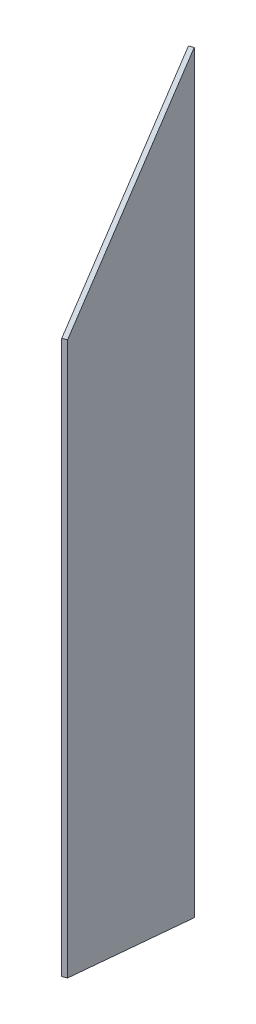
ISO-10303-21;
HEADER;
FILE_DESCRIPTION(('STEP AP214'),'2;1');
FILE_NAME('part.step','',(''),(''),'','','');
FILE_SCHEMA(('AUTOMOTIVE_DESIGN { 1 0 10303 214 1 1 1 1 }'));
ENDSEC;
DATA;
#1=APPLICATION_CONTEXT('core data for automotive mechanical design processes');
#2=APPLICATION_PROTOCOL_DEFINITION('international standard','automotive_design',2000,#1);
#3=PRODUCT_CONTEXT('',#1,'mechanical');
#4=PRODUCT('Part','Part','',(#3));
#5=PRODUCT_RELATED_PRODUCT_CATEGORY('part','',(#4));
#6=PRODUCT_DEFINITION_FORMATION('','',#4);
#7=PRODUCT_DEFINITION_CONTEXT('part definition',#1,'design');
#8=PRODUCT_DEFINITION('design','',#6,#7);
#9=PRODUCT_DEFINITION_SHAPE('','',#8);
#10=(LENGTH_UNIT() NAMED_UNIT(*) SI_UNIT(.MILLI.,.METRE.));
#11=(NAMED_UNIT(*) PLANE_ANGLE_UNIT() SI_UNIT($,.RADIAN.));
#12=(NAMED_UNIT(*) SI_UNIT($,.STERADIAN.) SOLID_ANGLE_UNIT());
#13=UNCERTAINTY_MEASURE_WITH_UNIT(LENGTH_MEASURE(1.E-05),#10,'distance_accuracy_value','');
#14=(GEOMETRIC_REPRESENTATION_CONTEXT(3) GLOBAL_UNCERTAINTY_ASSIGNED_CONTEXT((#13)) GLOBAL_UNIT_ASSIGNED_CONTEXT((#10,
#11,#12)) REPRESENTATION_CONTEXT('',''));
#15=CARTESIAN_POINT('',(0.,0.,0.));
#16=DIRECTION('',(0.,0.,1.));
#17=DIRECTION('',(1.,0.,0.));
#18=AXIS2_PLACEMENT_3D('',#15,#16,#17);
#19=CARTESIAN_POINT('',(-474.228670807716,-4.98995822645678E-13,1549.99133609266));
#20=DIRECTION('',(-0.924042960916819,0.,0.382288642755808));
#21=DIRECTION('',(0.382288642755808,0.,0.924042960916819));
#22=AXIS2_PLACEMENT_3D('',#19,#20,#21);
#23=PLANE('',#22);
#24=DIRECTION('',(-0.351214107835734,0.394922425952043,-0.848931639142576));
#25=VECTOR('',#24,1.);
#26=CARTESIAN_POINT('',(-410.979926983894,391.159999999987,1702.87203925927));
#27=LINE('',#26,#25);
#28=CARTESIAN_POINT('',(-410.979926983946,391.159999999997,1702.8720392593));
#29=VERTEX_POINT('',#28);
#30=CARTESIAN_POINT('',(-537.477414631339,533.399999999992,1397.11063292608));
#31=VERTEX_POINT('',#30);
#32=EDGE_CURVE('E78',#29,#31,#27,.T.);
#33=ORIENTED_EDGE('',*,*,#32,.F.);
#34=DIRECTION('',(0.,1.,0.));
#35=VECTOR('',#34,1.);
#36=CARTESIAN_POINT('',(-410.979926983886,-209.20902555782,1702.87203925929));
#37=LINE('',#36,#35);
#38=CARTESIAN_POINT('',(-410.979926983949,-391.159999999981,1702.87203925929));
#39=VERTEX_POINT('',#38);
#40=EDGE_CURVE('E54',#39,#29,#37,.T.);
#41=ORIENTED_EDGE('',*,*,#40,.F.);
#42=DIRECTION('',(0.351214107835735,0.394922425952044,0.848931639142576));
#43=VECTOR('',#42,1.);
#44=CARTESIAN_POINT('',(-537.477414631301,-533.399999999905,1397.11063292602));
#45=LINE('',#44,#43);
#46=CARTESIAN_POINT('',(-537.477414631342,-533.399999999976,1397.11063292607));
#47=VERTEX_POINT('',#46);
#48=EDGE_CURVE('E56',#47,#39,#45,.T.);
#49=ORIENTED_EDGE('',*,*,#48,.F.);
#50=DIRECTION('',(0.,1.,0.));
#51=VECTOR('',#50,1.);
#52=CARTESIAN_POINT('',(-537.47741463128,-104.520149076403,1397.11063292607));
#53=LINE('',#52,#51);
#54=EDGE_CURVE('E19',#31,#47,#53,.F.);
#55=ORIENTED_EDGE('',*,*,#54,.F.);
#56=EDGE_LOOP('',(#33,#41,#49,#55));
#57=FACE_BOUND('',#56,.T.);
#58=ADVANCED_FACE('F16',(#57),#23,.F.);
#59=CARTESIAN_POINT('',(-543.345087433128,-104.520149076403,1399.53816580758));
#60=DIRECTION('',(-0.382288642755808,0.,-0.924042960916819));
#61=DIRECTION('',(-0.924042960916819,0.,0.382288642755808));
#62=AXIS2_PLACEMENT_3D('',#59,#60,#61);
#63=PLANE('',#62);
#64=DIRECTION('',(0.,1.,0.));
#65=VECTOR('',#64,1.);
#66=CARTESIAN_POINT('',(-543.345087433234,-4.98650119007902E-13,1399.53816580762));
#67=LINE('',#66,#65);
#68=CARTESIAN_POINT('',(-543.345087433156,533.399999999991,1399.53816580759));
#69=VERTEX_POINT('',#68);
#70=CARTESIAN_POINT('',(-543.345087433159,-533.399999999975,1399.53816580758));
#71=VERTEX_POINT('',#70);
#72=EDGE_CURVE('E82',#69,#71,#67,.F.);
#73=ORIENTED_EDGE('',*,*,#72,.F.);
#74=DIRECTION('',(-0.924042960915975,-9.79094320924846E-13,0.382288642757848));
#75=VECTOR('',#74,1.);
#76=CARTESIAN_POINT('',(-537.477414631291,533.39999999997,1397.11063292604));
#77=LINE('',#76,#75);
#78=EDGE_CURVE('E67',#31,#69,#77,.T.);
#79=ORIENTED_EDGE('',*,*,#78,.F.);
#80=ORIENTED_EDGE('',*,*,#54,.T.);
#81=DIRECTION('',(0.924042960915978,-1.01406197524357E-12,-0.382288642757842));
#82=VECTOR('',#81,1.);
#83=CARTESIAN_POINT('',(-543.345087433145,-533.399999999899,1399.53816580754));
#84=LINE('',#83,#82);
#85=EDGE_CURVE('E62',#71,#47,#84,.T.);
#86=ORIENTED_EDGE('',*,*,#85,.F.);
#87=EDGE_LOOP('',(#73,#79,#80,#86));
#88=FACE_BOUND('',#87,.T.);
#89=ADVANCED_FACE('F64',(#88),#63,.T.);
#90=CARTESIAN_POINT('',(-506.369549423214,-491.822885510504,1488.91300409184));
#91=DIRECTION('',(0.150974358210998,-0.91871447005049,0.364925287809196));
#92=DIRECTION('',(0.,-0.369156680108664,-0.929367174765254));
#93=AXIS2_PLACEMENT_3D('',#90,#91,#92);
#94=PLANE('',#93);
#95=DIRECTION('',(0.351214107835715,0.394922425952093,0.848931639142562));
#96=VECTOR('',#95,1.);
#97=CARTESIAN_POINT('',(-543.345087433234,-533.4,1399.53816580762));
#98=LINE('',#97,#96);
#99=CARTESIAN_POINT('',(-416.847599785768,-391.159999999958,1705.29957214079));
#100=VERTEX_POINT('',#99);
#101=EDGE_CURVE('E71',#71,#100,#98,.T.);
#102=ORIENTED_EDGE('',*,*,#101,.F.);
#103=ORIENTED_EDGE('',*,*,#85,.T.);
#104=ORIENTED_EDGE('',*,*,#48,.T.);
#105=DIRECTION('',(0.924042960916819,0.,-0.382288642755808));
#106=VECTOR('',#105,1.);
#107=CARTESIAN_POINT('',(-416.847599785734,-391.16,1705.2995721408));
#108=LINE('',#107,#106);
#109=EDGE_CURVE('E74',#100,#39,#108,.T.);
#110=ORIENTED_EDGE('',*,*,#109,.F.);
#111=EDGE_LOOP('',(#102,#103,#104,#110));
#112=FACE_BOUND('',#111,.T.);
#113=ADVANCED_FACE('F69',(#112),#94,.T.);
#114=CARTESIAN_POINT('',(-416.847599785734,-209.20902555782,1705.2995721408));
#115=DIRECTION('',(0.382288642755808,0.,0.924042960916819));
#116=DIRECTION('',(0.924042960916819,0.,-0.382288642755808));
#117=AXIS2_PLACEMENT_3D('',#114,#115,#116);
#118=PLANE('',#117);
#119=DIRECTION('',(0.,1.,0.));
#120=VECTOR('',#119,1.);
#121=CARTESIAN_POINT('',(-416.847599785844,-4.98650119007902E-13,1705.29957214084));
#122=LINE('',#121,#120);
#123=CARTESIAN_POINT('',(-416.847599785762,391.159999999995,1705.29957214081));
#124=VERTEX_POINT('',#123);
#125=EDGE_CURVE('E25',#100,#124,#122,.T.);
#126=ORIENTED_EDGE('',*,*,#125,.F.);
#127=ORIENTED_EDGE('',*,*,#109,.T.);
#128=ORIENTED_EDGE('',*,*,#40,.T.);
#129=DIRECTION('',(0.924042960915978,9.96578148084202E-13,-0.382288642757842));
#130=VECTOR('',#129,1.);
#131=CARTESIAN_POINT('',(-416.847599785737,391.159999999981,1705.29957214079));
#132=LINE('',#131,#130);
#133=EDGE_CURVE('E34',#124,#29,#132,.T.);
#134=ORIENTED_EDGE('',*,*,#133,.F.);
#135=EDGE_LOOP('',(#126,#127,#128,#134));
#136=FACE_BOUND('',#135,.T.);
#137=ADVANCED_FACE('F88',(#136),#118,.T.);
#138=CARTESIAN_POINT('',(-488.852559074994,472.125919559074,1531.25392092139));
#139=DIRECTION('',(0.150974358210998,0.91871447005049,0.364925287809196));
#140=DIRECTION('',(0.,-0.369156680108664,0.929367174765254));
#141=AXIS2_PLACEMENT_3D('',#138,#139,#140);
#142=PLANE('',#141);
#143=DIRECTION('',(-0.351214107835715,0.394922425952093,-0.848931639142562));
#144=VECTOR('',#143,1.);
#145=CARTESIAN_POINT('',(-416.847599785844,391.16,1705.29957214084));
#146=LINE('',#145,#144);
#147=EDGE_CURVE('E11',#124,#69,#146,.T.);
#148=ORIENTED_EDGE('',*,*,#147,.F.);
#149=ORIENTED_EDGE('',*,*,#133,.T.);
#150=ORIENTED_EDGE('',*,*,#32,.T.);
#151=ORIENTED_EDGE('',*,*,#78,.T.);
#152=EDGE_LOOP('',(#148,#149,#150,#151));
#153=FACE_BOUND('',#152,.T.);
#154=ADVANCED_FACE('F90',(#153),#142,.T.);
#155=CARTESIAN_POINT('',(-480.096343609558,-4.98650119007902E-13,1552.41886897419));
#156=DIRECTION('',(-0.924042960916819,0.,0.382288642755808));
#157=DIRECTION('',(0.382288642755808,0.,0.924042960916819));
#158=AXIS2_PLACEMENT_3D('',#155,#156,#157);
#159=PLANE('',#158);
#160=ORIENTED_EDGE('',*,*,#125,.T.);
#161=ORIENTED_EDGE('',*,*,#147,.T.);
#162=ORIENTED_EDGE('',*,*,#72,.T.);
#163=ORIENTED_EDGE('',*,*,#101,.T.);
#164=EDGE_LOOP('',(#160,#161,#162,#163));
#165=FACE_BOUND('',#164,.T.);
#166=ADVANCED_FACE('F87',(#165),#159,.T.);
#167=CLOSED_SHELL('',(#58,#89,#113,#137,#154,#166));
#168=MANIFOLD_SOLID_BREP('B1',#167);
#169=ADVANCED_BREP_SHAPE_REPRESENTATION('',(#18,#168),#14);
#170=SHAPE_DEFINITION_REPRESENTATION(#9,#169);
ENDSEC;
END-ISO-10303-21;
